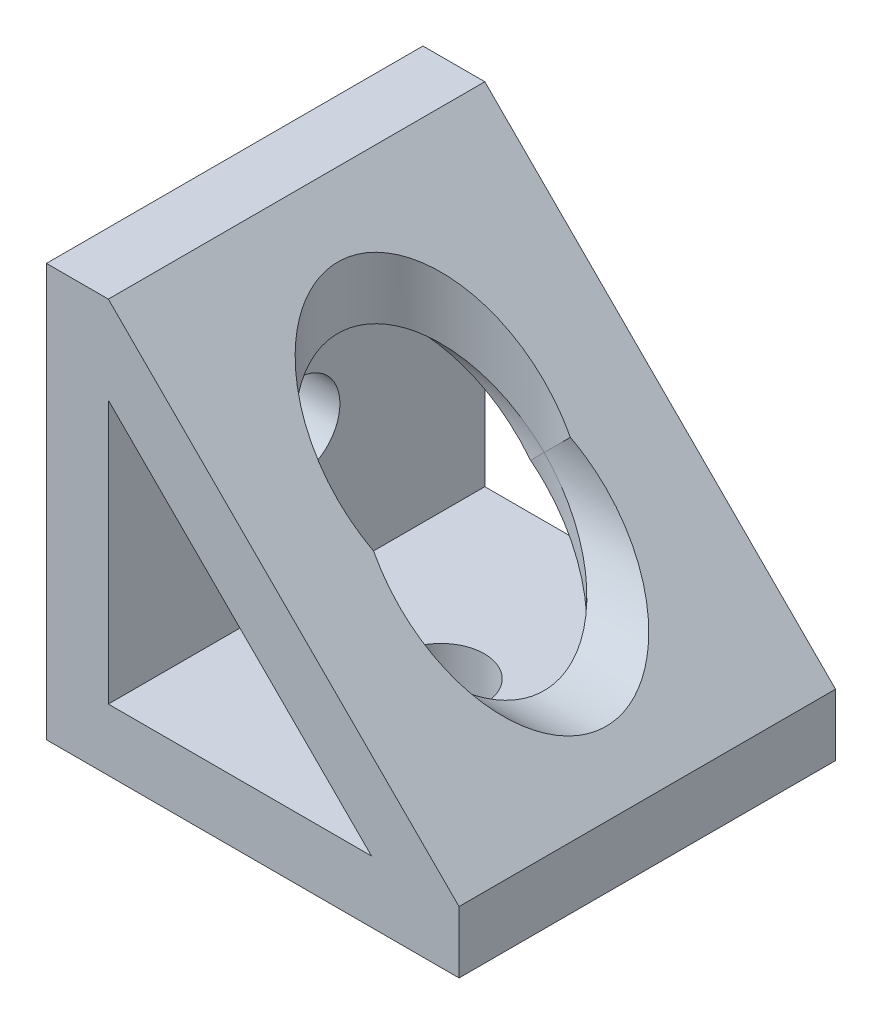
ISO-10303-21;
HEADER;
FILE_DESCRIPTION(('STEP AP214'),'2;1');
FILE_NAME('part.step','',(''),(''),'','','');
FILE_SCHEMA(('AUTOMOTIVE_DESIGN { 1 0 10303 214 1 1 1 1 }'));
ENDSEC;
DATA;
#1=APPLICATION_CONTEXT('core data for automotive mechanical design processes');
#2=APPLICATION_PROTOCOL_DEFINITION('international standard','automotive_design',2000,#1);
#3=PRODUCT_CONTEXT('',#1,'mechanical');
#4=PRODUCT('Part','Part','',(#3));
#5=PRODUCT_RELATED_PRODUCT_CATEGORY('part','',(#4));
#6=PRODUCT_DEFINITION_FORMATION('','',#4);
#7=PRODUCT_DEFINITION_CONTEXT('part definition',#1,'design');
#8=PRODUCT_DEFINITION('design','',#6,#7);
#9=PRODUCT_DEFINITION_SHAPE('','',#8);
#10=(LENGTH_UNIT() NAMED_UNIT(*) SI_UNIT(.MILLI.,.METRE.));
#11=(NAMED_UNIT(*) PLANE_ANGLE_UNIT() SI_UNIT($,.RADIAN.));
#12=(NAMED_UNIT(*) SI_UNIT($,.STERADIAN.) SOLID_ANGLE_UNIT());
#13=UNCERTAINTY_MEASURE_WITH_UNIT(LENGTH_MEASURE(1.E-05),#10,'distance_accuracy_value','');
#14=(GEOMETRIC_REPRESENTATION_CONTEXT(3) GLOBAL_UNCERTAINTY_ASSIGNED_CONTEXT((#13)) GLOBAL_UNIT_ASSIGNED_CONTEXT((#10,
#11,#12)) REPRESENTATION_CONTEXT('',''));
#15=CARTESIAN_POINT('',(0.,0.,0.));
#16=DIRECTION('',(0.,0.,1.));
#17=DIRECTION('',(1.,0.,0.));
#18=AXIS2_PLACEMENT_3D('',#15,#16,#17);
#19=CARTESIAN_POINT('',(0.,20.,0.));
#20=DIRECTION('',(0.,-1.,0.));
#21=DIRECTION('',(0.,0.,-1.));
#22=AXIS2_PLACEMENT_3D('',#19,#20,#21);
#23=CYLINDRICAL_SURFACE('',#22,10.);
#24=CARTESIAN_POINT('',(0.,0.,0.));
#25=DIRECTION('',(-0.707106781186548,-0.707106781186547,0.));
#26=DIRECTION('',(0.707106781186547,-0.707106781186548,0.));
#27=AXIS2_PLACEMENT_3D('',#24,#25,#26);
#28=ELLIPSE('',#27,14.1421356237309,10.);
#29=CARTESIAN_POINT('',(0.,0.,-10.));
#30=VERTEX_POINT('',#29);
#31=CARTESIAN_POINT('',(0.,0.,10.));
#32=VERTEX_POINT('',#31);
#33=EDGE_CURVE('E11',#30,#32,#28,.F.);
#34=ORIENTED_EDGE('',*,*,#33,.F.);
#35=CARTESIAN_POINT('',(0.,0.,0.));
#36=DIRECTION('',(0.707106781186547,-0.707106781186548,0.));
#37=DIRECTION('',(-0.707106781186548,-0.707106781186547,0.));
#38=AXIS2_PLACEMENT_3D('',#35,#36,#37);
#39=ELLIPSE('',#38,14.1421356237309,10.);
#40=CARTESIAN_POINT('',(3.,3.,-9.53939201416945));
#41=VERTEX_POINT('',#40);
#42=EDGE_CURVE('E119',#41,#30,#39,.F.);
#43=ORIENTED_EDGE('',*,*,#42,.F.);
#44=CARTESIAN_POINT('',(0.,6.,0.));
#45=DIRECTION('',(0.707106781186548,0.707106781186548,0.));
#46=DIRECTION('',(0.707106781186548,-0.707106781186548,0.));
#47=AXIS2_PLACEMENT_3D('',#44,#45,#46);
#48=ELLIPSE('',#47,14.1421356237309,10.);
#49=CARTESIAN_POINT('',(3.00000000000001,2.99999999999998,9.53939201416945));
#50=VERTEX_POINT('',#49);
#51=EDGE_CURVE('E203',#50,#41,#48,.F.);
#52=ORIENTED_EDGE('',*,*,#51,.F.);
#53=EDGE_CURVE('E118',#32,#50,#39,.F.);
#54=ORIENTED_EDGE('',*,*,#53,.F.);
#55=EDGE_LOOP('',(#34,#43,#52,#54));
#56=FACE_BOUND('',#55,.T.);
#57=ADVANCED_FACE('F32',(#56),#23,.F.);
#58=CARTESIAN_POINT('',(-14.,20.,-18.25));
#59=DIRECTION('',(0.,1.,0.));
#60=DIRECTION('',(0.,0.,1.));
#61=AXIS2_PLACEMENT_3D('',#58,#59,#60);
#62=PLANE('',#61);
#63=DIRECTION('',(0.,0.,1.));
#64=VECTOR('',#63,1.);
#65=CARTESIAN_POINT('',(-20.,20.,-18.25));
#66=LINE('',#65,#64);
#67=CARTESIAN_POINT('',(-20.,20.,-18.25));
#68=VERTEX_POINT('',#67);
#69=CARTESIAN_POINT('',(-20.,20.,18.25));
#70=VERTEX_POINT('',#69);
#71=EDGE_CURVE('E134',#68,#70,#66,.T.);
#72=ORIENTED_EDGE('',*,*,#71,.T.);
#73=DIRECTION('',(-1.,0.,0.));
#74=VECTOR('',#73,1.);
#75=CARTESIAN_POINT('',(-14.,20.,18.25));
#76=LINE('',#75,#74);
#77=CARTESIAN_POINT('',(-14.,20.,18.25));
#78=VERTEX_POINT('',#77);
#79=EDGE_CURVE('E185',#78,#70,#76,.T.);
#80=ORIENTED_EDGE('',*,*,#79,.F.);
#81=DIRECTION('',(0.,0.,1.));
#82=VECTOR('',#81,1.);
#83=CARTESIAN_POINT('',(-14.,20.,-18.25));
#84=LINE('',#83,#82);
#85=CARTESIAN_POINT('',(-14.,20.,-18.25));
#86=VERTEX_POINT('',#85);
#87=EDGE_CURVE('E129',#86,#78,#84,.T.);
#88=ORIENTED_EDGE('',*,*,#87,.F.);
#89=DIRECTION('',(-1.,0.,0.));
#90=VECTOR('',#89,1.);
#91=CARTESIAN_POINT('',(-14.,20.,-18.25));
#92=LINE('',#91,#90);
#93=EDGE_CURVE('E155',#86,#68,#92,.T.);
#94=ORIENTED_EDGE('',*,*,#93,.T.);
#95=EDGE_LOOP('',(#72,#80,#88,#94));
#96=FACE_BOUND('',#95,.T.);
#97=ADVANCED_FACE('F34',(#96),#62,.T.);
#98=CARTESIAN_POINT('',(20.,-14.,-18.25));
#99=DIRECTION('',(0.707106781186548,0.707106781186548,0.));
#100=DIRECTION('',(-0.707106781186548,0.707106781186548,0.));
#101=AXIS2_PLACEMENT_3D('',#98,#99,#100);
#102=PLANE('',#101);
#103=CARTESIAN_POINT('',(6.,0.,0.));
#104=DIRECTION('',(0.707106781186548,0.707106781186548,0.));
#105=DIRECTION('',(-0.707106781186548,0.707106781186548,0.));
#106=AXIS2_PLACEMENT_3D('',#103,#104,#105);
#107=ELLIPSE('',#106,14.1421356237309,10.);
#108=EDGE_CURVE('E125',#50,#41,#107,.T.);
#109=ORIENTED_EDGE('',*,*,#108,.F.);
#110=ORIENTED_EDGE('',*,*,#51,.T.);
#111=EDGE_LOOP('',(#109,#110));
#112=FACE_BOUND('',#111,.T.);
#113=ORIENTED_EDGE('',*,*,#87,.T.);
#114=DIRECTION('',(-0.707106781186547,0.707106781186547,0.));
#115=VECTOR('',#114,1.);
#116=CARTESIAN_POINT('',(20.,-14.,18.25));
#117=LINE('',#116,#115);
#118=CARTESIAN_POINT('',(20.,-14.,18.25));
#119=VERTEX_POINT('',#118);
#120=EDGE_CURVE('E173',#119,#78,#117,.T.);
#121=ORIENTED_EDGE('',*,*,#120,.F.);
#122=DIRECTION('',(0.,0.,1.));
#123=VECTOR('',#122,1.);
#124=CARTESIAN_POINT('',(20.,-14.,-18.25));
#125=LINE('',#124,#123);
#126=CARTESIAN_POINT('',(20.,-14.,-18.25));
#127=VERTEX_POINT('',#126);
#128=EDGE_CURVE('E141',#127,#119,#125,.T.);
#129=ORIENTED_EDGE('',*,*,#128,.F.);
#130=DIRECTION('',(-0.707106781186547,0.707106781186547,0.));
#131=VECTOR('',#130,1.);
#132=CARTESIAN_POINT('',(20.,-14.,-18.25));
#133=LINE('',#132,#131);
#134=EDGE_CURVE('E137',#127,#86,#133,.T.);
#135=ORIENTED_EDGE('',*,*,#134,.T.);
#136=EDGE_LOOP('',(#113,#121,#129,#135));
#137=FACE_BOUND('',#136,.T.);
#138=ADVANCED_FACE('F246',(#112,#137),#102,.T.);
#139=CARTESIAN_POINT('',(20.,-20.,-18.25));
#140=DIRECTION('',(1.,0.,0.));
#141=DIRECTION('',(0.,0.,-1.));
#142=AXIS2_PLACEMENT_3D('',#139,#140,#141);
#143=PLANE('',#142);
#144=ORIENTED_EDGE('',*,*,#128,.T.);
#145=DIRECTION('',(0.,1.,0.));
#146=VECTOR('',#145,1.);
#147=CARTESIAN_POINT('',(20.,-20.,18.25));
#148=LINE('',#147,#146);
#149=CARTESIAN_POINT('',(20.,-20.,18.25));
#150=VERTEX_POINT('',#149);
#151=EDGE_CURVE('E176',#150,#119,#148,.T.);
#152=ORIENTED_EDGE('',*,*,#151,.F.);
#153=DIRECTION('',(0.,0.,1.));
#154=VECTOR('',#153,1.);
#155=CARTESIAN_POINT('',(20.,-20.,-18.25));
#156=LINE('',#155,#154);
#157=CARTESIAN_POINT('',(20.,-20.,-18.25));
#158=VERTEX_POINT('',#157);
#159=EDGE_CURVE('E139',#158,#150,#156,.T.);
#160=ORIENTED_EDGE('',*,*,#159,.F.);
#161=DIRECTION('',(0.,1.,0.));
#162=VECTOR('',#161,1.);
#163=CARTESIAN_POINT('',(20.,-20.,-18.25));
#164=LINE('',#163,#162);
#165=EDGE_CURVE('E146',#158,#127,#164,.T.);
#166=ORIENTED_EDGE('',*,*,#165,.T.);
#167=EDGE_LOOP('',(#144,#152,#160,#166));
#168=FACE_BOUND('',#167,.T.);
#169=ADVANCED_FACE('F250',(#168),#143,.T.);
#170=CARTESIAN_POINT('',(-20.,-20.,-18.25));
#171=DIRECTION('',(0.,-1.,0.));
#172=DIRECTION('',(0.,0.,-1.));
#173=AXIS2_PLACEMENT_3D('',#170,#171,#172);
#174=PLANE('',#173);
#175=CARTESIAN_POINT('',(0.,-20.,0.));
#176=DIRECTION('',(0.,-1.,0.));
#177=DIRECTION('',(0.,0.,-1.));
#178=AXIS2_PLACEMENT_3D('',#175,#176,#177);
#179=CIRCLE('',#178,4.2);
#180=CARTESIAN_POINT('',(0.,-20.,-4.2));
#181=VERTEX_POINT('',#180);
#182=EDGE_CURVE('E197',#181,#181,#179,.T.);
#183=ORIENTED_EDGE('',*,*,#182,.F.);
#184=EDGE_LOOP('',(#183));
#185=FACE_BOUND('',#184,.T.);
#186=ORIENTED_EDGE('',*,*,#159,.T.);
#187=DIRECTION('',(1.,0.,0.));
#188=VECTOR('',#187,1.);
#189=CARTESIAN_POINT('',(-20.,-20.,18.25));
#190=LINE('',#189,#188);
#191=CARTESIAN_POINT('',(-20.,-20.,18.25));
#192=VERTEX_POINT('',#191);
#193=EDGE_CURVE('E179',#192,#150,#190,.T.);
#194=ORIENTED_EDGE('',*,*,#193,.F.);
#195=DIRECTION('',(0.,0.,1.));
#196=VECTOR('',#195,1.);
#197=CARTESIAN_POINT('',(-20.,-20.,-18.25));
#198=LINE('',#197,#196);
#199=CARTESIAN_POINT('',(-20.,-20.,-18.25));
#200=VERTEX_POINT('',#199);
#201=EDGE_CURVE('E136',#200,#192,#198,.T.);
#202=ORIENTED_EDGE('',*,*,#201,.F.);
#203=DIRECTION('',(1.,0.,0.));
#204=VECTOR('',#203,1.);
#205=CARTESIAN_POINT('',(-20.,-20.,-18.25));
#206=LINE('',#205,#204);
#207=EDGE_CURVE('E149',#200,#158,#206,.T.);
#208=ORIENTED_EDGE('',*,*,#207,.T.);
#209=EDGE_LOOP('',(#186,#194,#202,#208));
#210=FACE_BOUND('',#209,.T.);
#211=ADVANCED_FACE('F252',(#185,#210),#174,.T.);
#212=CARTESIAN_POINT('',(-20.,20.,-18.25));
#213=DIRECTION('',(-1.,0.,0.));
#214=DIRECTION('',(0.,-1.,0.));
#215=AXIS2_PLACEMENT_3D('',#212,#213,#214);
#216=PLANE('',#215);
#217=CARTESIAN_POINT('',(-20.,0.,0.));
#218=DIRECTION('',(1.,0.,0.));
#219=DIRECTION('',(0.,0.,-1.));
#220=AXIS2_PLACEMENT_3D('',#217,#218,#219);
#221=CIRCLE('',#220,4.2);
#222=CARTESIAN_POINT('',(-20.,0.,-4.2));
#223=VERTEX_POINT('',#222);
#224=EDGE_CURVE('E208',#223,#223,#221,.T.);
#225=ORIENTED_EDGE('',*,*,#224,.T.);
#226=EDGE_LOOP('',(#225));
#227=FACE_BOUND('',#226,.T.);
#228=ORIENTED_EDGE('',*,*,#201,.T.);
#229=DIRECTION('',(0.,-1.,0.));
#230=VECTOR('',#229,1.);
#231=CARTESIAN_POINT('',(-20.,20.,18.25));
#232=LINE('',#231,#230);
#233=EDGE_CURVE('E182',#70,#192,#232,.T.);
#234=ORIENTED_EDGE('',*,*,#233,.F.);
#235=ORIENTED_EDGE('',*,*,#71,.F.);
#236=DIRECTION('',(0.,-1.,0.));
#237=VECTOR('',#236,1.);
#238=CARTESIAN_POINT('',(-20.,20.,-18.25));
#239=LINE('',#238,#237);
#240=EDGE_CURVE('E152',#68,#200,#239,.T.);
#241=ORIENTED_EDGE('',*,*,#240,.T.);
#242=EDGE_LOOP('',(#228,#234,#235,#241));
#243=FACE_BOUND('',#242,.T.);
#244=ADVANCED_FACE('F237',(#227,#243),#216,.T.);
#245=CARTESIAN_POINT('',(0.,0.,-18.25));
#246=DIRECTION('',(0.,0.,1.));
#247=DIRECTION('',(1.,0.,0.));
#248=AXIS2_PLACEMENT_3D('',#245,#246,#247);
#249=PLANE('',#248);
#250=DIRECTION('',(1.,0.,0.));
#251=VECTOR('',#250,1.);
#252=CARTESIAN_POINT('',(-14.,-14.,-18.25));
#253=LINE('',#252,#251);
#254=CARTESIAN_POINT('',(-14.,-14.,-18.25));
#255=VERTEX_POINT('',#254);
#256=CARTESIAN_POINT('',(11.5147186257614,-14.,-18.25));
#257=VERTEX_POINT('',#256);
#258=EDGE_CURVE('E162',#255,#257,#253,.T.);
#259=ORIENTED_EDGE('',*,*,#258,.T.);
#260=DIRECTION('',(-0.707106781186547,0.707106781186548,0.));
#261=VECTOR('',#260,1.);
#262=CARTESIAN_POINT('',(11.5147186257614,-14.,-18.25));
#263=LINE('',#262,#261);
#264=CARTESIAN_POINT('',(-14.,11.5147186257614,-18.25));
#265=VERTEX_POINT('',#264);
#266=EDGE_CURVE('E170',#257,#265,#263,.T.);
#267=ORIENTED_EDGE('',*,*,#266,.T.);
#268=DIRECTION('',(0.,-1.,0.));
#269=VECTOR('',#268,1.);
#270=CARTESIAN_POINT('',(-14.,11.5147186257614,-18.25));
#271=LINE('',#270,#269);
#272=EDGE_CURVE('E167',#265,#255,#271,.T.);
#273=ORIENTED_EDGE('',*,*,#272,.T.);
#274=EDGE_LOOP('',(#259,#267,#273));
#275=FACE_BOUND('',#274,.T.);
#276=ORIENTED_EDGE('',*,*,#93,.F.);
#277=ORIENTED_EDGE('',*,*,#134,.F.);
#278=ORIENTED_EDGE('',*,*,#165,.F.);
#279=ORIENTED_EDGE('',*,*,#207,.F.);
#280=ORIENTED_EDGE('',*,*,#240,.F.);
#281=EDGE_LOOP('',(#276,#277,#278,#279,#280));
#282=FACE_BOUND('',#281,.T.);
#283=ADVANCED_FACE('F219',(#275,#282),#249,.F.);
#284=CARTESIAN_POINT('',(11.5147186257614,-14.,-18.25));
#285=DIRECTION('',(0.707106781186548,0.707106781186547,0.));
#286=DIRECTION('',(-0.707106781186547,0.707106781186548,0.));
#287=AXIS2_PLACEMENT_3D('',#284,#285,#286);
#288=PLANE('',#287);
#289=CARTESIAN_POINT('',(0.,-2.48528137423857,0.));
#290=DIRECTION('',(0.707106781186548,0.707106781186547,0.));
#291=DIRECTION('',(0.707106781186547,-0.707106781186548,0.));
#292=AXIS2_PLACEMENT_3D('',#289,#290,#291);
#293=ELLIPSE('',#292,14.1421356237309,10.);
#294=CARTESIAN_POINT('',(-1.24264068711928,-1.24264068711928,-9.92249183031741));
#295=VERTEX_POINT('',#294);
#296=CARTESIAN_POINT('',(-1.24264068711911,-1.24264068711945,9.92249183031741));
#297=VERTEX_POINT('',#296);
#298=EDGE_CURVE('E205',#295,#297,#293,.F.);
#299=ORIENTED_EDGE('',*,*,#298,.F.);
#300=CARTESIAN_POINT('',(-2.48528137423857,0.,0.));
#301=DIRECTION('',(0.707106781186548,0.707106781186547,0.));
#302=DIRECTION('',(-0.707106781186547,0.707106781186548,0.));
#303=AXIS2_PLACEMENT_3D('',#300,#301,#302);
#304=ELLIPSE('',#303,14.1421356237309,10.);
#305=EDGE_CURVE('E53',#295,#297,#304,.T.);
#306=ORIENTED_EDGE('',*,*,#305,.T.);
#307=EDGE_LOOP('',(#299,#306));
#308=FACE_BOUND('',#307,.T.);
#309=DIRECTION('',(0.,0.,1.));
#310=VECTOR('',#309,1.);
#311=CARTESIAN_POINT('',(11.5147186257614,-14.,-18.25));
#312=LINE('',#311,#310);
#313=CARTESIAN_POINT('',(11.5147186257614,-14.,18.25));
#314=VERTEX_POINT('',#313);
#315=EDGE_CURVE('E158',#257,#314,#312,.T.);
#316=ORIENTED_EDGE('',*,*,#315,.T.);
#317=DIRECTION('',(-0.707106781186547,0.707106781186548,0.));
#318=VECTOR('',#317,1.);
#319=CARTESIAN_POINT('',(11.5147186257614,-14.,18.25));
#320=LINE('',#319,#318);
#321=CARTESIAN_POINT('',(-14.,11.5147186257614,18.25));
#322=VERTEX_POINT('',#321);
#323=EDGE_CURVE('E194',#314,#322,#320,.T.);
#324=ORIENTED_EDGE('',*,*,#323,.T.);
#325=DIRECTION('',(0.,0.,1.));
#326=VECTOR('',#325,1.);
#327=CARTESIAN_POINT('',(-14.,11.5147186257614,-18.25));
#328=LINE('',#327,#326);
#329=EDGE_CURVE('E159',#265,#322,#328,.T.);
#330=ORIENTED_EDGE('',*,*,#329,.F.);
#331=ORIENTED_EDGE('',*,*,#266,.F.);
#332=EDGE_LOOP('',(#316,#324,#330,#331));
#333=FACE_BOUND('',#332,.T.);
#334=ADVANCED_FACE('F215',(#308,#333),#288,.F.);
#335=CARTESIAN_POINT('',(-14.,-14.,-18.25));
#336=DIRECTION('',(0.,-1.,0.));
#337=DIRECTION('',(0.,0.,-1.));
#338=AXIS2_PLACEMENT_3D('',#335,#336,#337);
#339=PLANE('',#338);
#340=DIRECTION('',(0.,0.,1.));
#341=VECTOR('',#340,1.);
#342=CARTESIAN_POINT('',(-14.,-14.,-18.25));
#343=LINE('',#342,#341);
#344=CARTESIAN_POINT('',(-14.,-14.,18.25));
#345=VERTEX_POINT('',#344);
#346=EDGE_CURVE('E161',#255,#345,#343,.T.);
#347=ORIENTED_EDGE('',*,*,#346,.T.);
#348=DIRECTION('',(1.,0.,0.));
#349=VECTOR('',#348,1.);
#350=CARTESIAN_POINT('',(-14.,-14.,18.25));
#351=LINE('',#350,#349);
#352=EDGE_CURVE('E188',#345,#314,#351,.T.);
#353=ORIENTED_EDGE('',*,*,#352,.T.);
#354=ORIENTED_EDGE('',*,*,#315,.F.);
#355=ORIENTED_EDGE('',*,*,#258,.F.);
#356=EDGE_LOOP('',(#347,#353,#354,#355));
#357=FACE_BOUND('',#356,.T.);
#358=CARTESIAN_POINT('',(0.,-14.,0.));
#359=DIRECTION('',(0.,-1.,0.));
#360=DIRECTION('',(0.,0.,-1.));
#361=AXIS2_PLACEMENT_3D('',#358,#359,#360);
#362=CIRCLE('',#361,4.2);
#363=CARTESIAN_POINT('',(0.,-14.,-4.2));
#364=VERTEX_POINT('',#363);
#365=EDGE_CURVE('E200',#364,#364,#362,.F.);
#366=ORIENTED_EDGE('',*,*,#365,.F.);
#367=EDGE_LOOP('',(#366));
#368=FACE_BOUND('',#367,.T.);
#369=ADVANCED_FACE('F218',(#357,#368),#339,.F.);
#370=CARTESIAN_POINT('',(-14.,11.5147186257614,-18.25));
#371=DIRECTION('',(-1.,0.,0.));
#372=DIRECTION('',(0.,-1.,0.));
#373=AXIS2_PLACEMENT_3D('',#370,#371,#372);
#374=PLANE('',#373);
#375=ORIENTED_EDGE('',*,*,#329,.T.);
#376=DIRECTION('',(0.,-1.,0.));
#377=VECTOR('',#376,1.);
#378=CARTESIAN_POINT('',(-14.,11.5147186257614,18.25));
#379=LINE('',#378,#377);
#380=EDGE_CURVE('E191',#322,#345,#379,.T.);
#381=ORIENTED_EDGE('',*,*,#380,.T.);
#382=ORIENTED_EDGE('',*,*,#346,.F.);
#383=ORIENTED_EDGE('',*,*,#272,.F.);
#384=EDGE_LOOP('',(#375,#381,#382,#383));
#385=FACE_BOUND('',#384,.T.);
#386=CARTESIAN_POINT('',(-14.,0.,0.));
#387=DIRECTION('',(-1.,0.,0.));
#388=DIRECTION('',(0.,-1.,0.));
#389=AXIS2_PLACEMENT_3D('',#386,#387,#388);
#390=CIRCLE('',#389,4.2);
#391=CARTESIAN_POINT('',(-14.,-4.2,0.));
#392=VERTEX_POINT('',#391);
#393=EDGE_CURVE('E207',#392,#392,#390,.T.);
#394=ORIENTED_EDGE('',*,*,#393,.T.);
#395=EDGE_LOOP('',(#394));
#396=FACE_BOUND('',#395,.T.);
#397=ADVANCED_FACE('F231',(#385,#396),#374,.F.);
#398=CARTESIAN_POINT('',(0.,0.,18.25));
#399=DIRECTION('',(0.,0.,1.));
#400=DIRECTION('',(1.,0.,0.));
#401=AXIS2_PLACEMENT_3D('',#398,#399,#400);
#402=PLANE('',#401);
#403=ORIENTED_EDGE('',*,*,#79,.T.);
#404=ORIENTED_EDGE('',*,*,#233,.T.);
#405=ORIENTED_EDGE('',*,*,#193,.T.);
#406=ORIENTED_EDGE('',*,*,#151,.T.);
#407=ORIENTED_EDGE('',*,*,#120,.T.);
#408=EDGE_LOOP('',(#403,#404,#405,#406,#407));
#409=FACE_BOUND('',#408,.T.);
#410=ORIENTED_EDGE('',*,*,#380,.F.);
#411=ORIENTED_EDGE('',*,*,#323,.F.);
#412=ORIENTED_EDGE('',*,*,#352,.F.);
#413=EDGE_LOOP('',(#410,#411,#412));
#414=FACE_BOUND('',#413,.T.);
#415=ADVANCED_FACE('F229',(#409,#414),#402,.T.);
#416=CARTESIAN_POINT('',(0.,20.001,0.));
#417=DIRECTION('',(0.,-1.,0.));
#418=DIRECTION('',(0.,0.,-1.));
#419=AXIS2_PLACEMENT_3D('',#416,#417,#418);
#420=CYLINDRICAL_SURFACE('',#419,4.2);
#421=ORIENTED_EDGE('',*,*,#182,.T.);
#422=EDGE_LOOP('',(#421));
#423=FACE_BOUND('',#422,.T.);
#424=ORIENTED_EDGE('',*,*,#365,.T.);
#425=EDGE_LOOP('',(#424));
#426=FACE_BOUND('',#425,.T.);
#427=ADVANCED_FACE('F272',(#423,#426),#420,.F.);
#428=CARTESIAN_POINT('',(0.,0.,0.));
#429=DIRECTION('',(-0.707106781186548,-0.707106781186547,0.));
#430=DIRECTION('',(0.707106781186547,-0.707106781186548,0.));
#431=AXIS2_PLACEMENT_3D('',#428,#429,#430);
#432=ELLIPSE('',#431,14.1421356237309,10.);
#433=EDGE_CURVE('E40',#30,#32,#432,.T.);
#434=ORIENTED_EDGE('',*,*,#433,.F.);
#435=CARTESIAN_POINT('',(0.,0.,0.));
#436=DIRECTION('',(0.707106781186547,-0.707106781186548,0.));
#437=DIRECTION('',(-0.707106781186548,-0.707106781186547,0.));
#438=AXIS2_PLACEMENT_3D('',#435,#436,#437);
#439=ELLIPSE('',#438,14.1421356237309,10.);
#440=EDGE_CURVE('E111',#295,#30,#439,.T.);
#441=ORIENTED_EDGE('',*,*,#440,.F.);
#442=ORIENTED_EDGE('',*,*,#298,.T.);
#443=EDGE_CURVE('E121',#32,#297,#439,.T.);
#444=ORIENTED_EDGE('',*,*,#443,.F.);
#445=EDGE_LOOP('',(#434,#441,#442,#444));
#446=FACE_BOUND('',#445,.T.);
#447=ADVANCED_FACE('F132',(#446),#23,.F.);
#448=CARTESIAN_POINT('',(20.001,0.,0.));
#449=DIRECTION('',(-1.,0.,0.));
#450=DIRECTION('',(0.,-1.,0.));
#451=AXIS2_PLACEMENT_3D('',#448,#449,#450);
#452=CYLINDRICAL_SURFACE('',#451,4.2);
#453=ORIENTED_EDGE('',*,*,#224,.F.);
#454=EDGE_LOOP('',(#453));
#455=FACE_BOUND('',#454,.T.);
#456=ORIENTED_EDGE('',*,*,#393,.F.);
#457=EDGE_LOOP('',(#456));
#458=FACE_BOUND('',#457,.T.);
#459=ADVANCED_FACE('F271',(#455,#458),#452,.F.);
#460=CARTESIAN_POINT('',(20.,0.,0.));
#461=DIRECTION('',(-1.,0.,0.));
#462=DIRECTION('',(0.,-1.,0.));
#463=AXIS2_PLACEMENT_3D('',#460,#461,#462);
#464=CYLINDRICAL_SURFACE('',#463,10.);
#465=ORIENTED_EDGE('',*,*,#433,.T.);
#466=ORIENTED_EDGE('',*,*,#53,.T.);
#467=ORIENTED_EDGE('',*,*,#108,.T.);
#468=ORIENTED_EDGE('',*,*,#42,.T.);
#469=EDGE_LOOP('',(#465,#466,#467,#468));
#470=FACE_BOUND('',#469,.T.);
#471=ADVANCED_FACE('F123',(#470),#464,.F.);
#472=ORIENTED_EDGE('',*,*,#33,.T.);
#473=ORIENTED_EDGE('',*,*,#443,.T.);
#474=ORIENTED_EDGE('',*,*,#305,.F.);
#475=ORIENTED_EDGE('',*,*,#440,.T.);
#476=EDGE_LOOP('',(#472,#473,#474,#475));
#477=FACE_BOUND('',#476,.T.);
#478=ADVANCED_FACE('F112',(#477),#464,.F.);
#479=CLOSED_SHELL('',(#57,#97,#138,#169,#211,#244,#283,#334,#369,#397,#415,#427,#447,#459,#471,#478));
#480=MANIFOLD_SOLID_BREP('B2',#479);
#481=ADVANCED_BREP_SHAPE_REPRESENTATION('',(#18,#480),#14);
#482=SHAPE_DEFINITION_REPRESENTATION(#9,#481);
ENDSEC;
END-ISO-10303-21;
